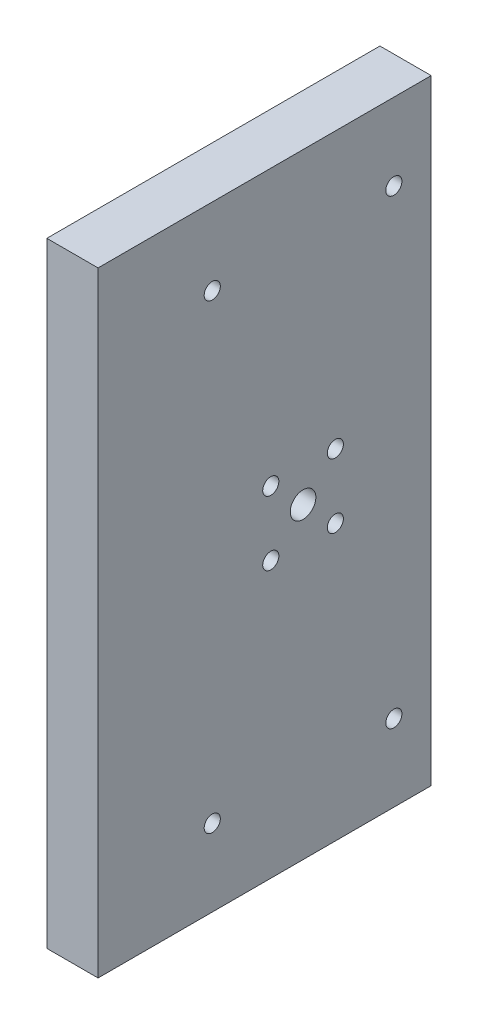
ISO-10303-21;
HEADER;
FILE_DESCRIPTION(('STEP AP214'),'2;1');
FILE_NAME('part.step','',(''),(''),'','','');
FILE_SCHEMA(('AUTOMOTIVE_DESIGN { 1 0 10303 214 1 1 1 1 }'));
ENDSEC;
DATA;
#1=APPLICATION_CONTEXT('core data for automotive mechanical design processes');
#2=APPLICATION_PROTOCOL_DEFINITION('international standard','automotive_design',2000,#1);
#3=PRODUCT_CONTEXT('',#1,'mechanical');
#4=PRODUCT('Part','Part','',(#3));
#5=PRODUCT_RELATED_PRODUCT_CATEGORY('part','',(#4));
#6=PRODUCT_DEFINITION_FORMATION('','',#4);
#7=PRODUCT_DEFINITION_CONTEXT('part definition',#1,'design');
#8=PRODUCT_DEFINITION('design','',#6,#7);
#9=PRODUCT_DEFINITION_SHAPE('','',#8);
#10=(LENGTH_UNIT() NAMED_UNIT(*) SI_UNIT(.MILLI.,.METRE.));
#11=(NAMED_UNIT(*) PLANE_ANGLE_UNIT() SI_UNIT($,.RADIAN.));
#12=(NAMED_UNIT(*) SI_UNIT($,.STERADIAN.) SOLID_ANGLE_UNIT());
#13=UNCERTAINTY_MEASURE_WITH_UNIT(LENGTH_MEASURE(1.E-05),#10,'distance_accuracy_value','');
#14=(GEOMETRIC_REPRESENTATION_CONTEXT(3) GLOBAL_UNCERTAINTY_ASSIGNED_CONTEXT((#13)) GLOBAL_UNIT_ASSIGNED_CONTEXT((#10,
#11,#12)) REPRESENTATION_CONTEXT('',''));
#15=CARTESIAN_POINT('',(0.,0.,0.));
#16=DIRECTION('',(0.,0.,1.));
#17=DIRECTION('',(1.,0.,0.));
#18=AXIS2_PLACEMENT_3D('',#15,#16,#17);
#19=CARTESIAN_POINT('',(12.7,76.2,-41.275));
#20=DIRECTION('',(0.,0.,1.));
#21=DIRECTION('',(0.,-1.,0.));
#22=AXIS2_PLACEMENT_3D('',#19,#20,#21);
#23=PLANE('',#22);
#24=DIRECTION('',(0.,1.,0.));
#25=VECTOR('',#24,1.);
#26=CARTESIAN_POINT('',(0.,76.2,-41.275));
#27=LINE('',#26,#25);
#28=CARTESIAN_POINT('',(0.,-76.2,-41.275));
#29=VERTEX_POINT('',#28);
#30=CARTESIAN_POINT('',(0.,76.2,-41.275));
#31=VERTEX_POINT('',#30);
#32=EDGE_CURVE('E102',#29,#31,#27,.T.);
#33=ORIENTED_EDGE('',*,*,#32,.T.);
#34=DIRECTION('',(-1.,0.,0.));
#35=VECTOR('',#34,1.);
#36=CARTESIAN_POINT('',(12.7,76.2,-41.275));
#37=LINE('',#36,#35);
#38=CARTESIAN_POINT('',(12.7,76.2,-41.275));
#39=VERTEX_POINT('',#38);
#40=EDGE_CURVE('E11',#39,#31,#37,.T.);
#41=ORIENTED_EDGE('',*,*,#40,.F.);
#42=DIRECTION('',(0.,1.,0.));
#43=VECTOR('',#42,1.);
#44=CARTESIAN_POINT('',(12.7,76.2,-41.275));
#45=LINE('',#44,#43);
#46=CARTESIAN_POINT('',(12.7,-76.2,-41.275));
#47=VERTEX_POINT('',#46);
#48=EDGE_CURVE('E89',#47,#39,#45,.T.);
#49=ORIENTED_EDGE('',*,*,#48,.F.);
#50=DIRECTION('',(-1.,0.,0.));
#51=VECTOR('',#50,1.);
#52=CARTESIAN_POINT('',(12.7,-76.2,-41.275));
#53=LINE('',#52,#51);
#54=EDGE_CURVE('E98',#47,#29,#53,.T.);
#55=ORIENTED_EDGE('',*,*,#54,.T.);
#56=EDGE_LOOP('',(#33,#41,#49,#55));
#57=FACE_BOUND('',#56,.T.);
#58=ADVANCED_FACE('F36',(#57),#23,.F.);
#59=CARTESIAN_POINT('',(12.7,76.2,41.275));
#60=DIRECTION('',(0.,-1.,0.));
#61=DIRECTION('',(0.,0.,-1.));
#62=AXIS2_PLACEMENT_3D('',#59,#60,#61);
#63=PLANE('',#62);
#64=DIRECTION('',(0.,0.,1.));
#65=VECTOR('',#64,1.);
#66=CARTESIAN_POINT('',(0.,76.2,41.275));
#67=LINE('',#66,#65);
#68=CARTESIAN_POINT('',(0.,76.2,41.275));
#69=VERTEX_POINT('',#68);
#70=EDGE_CURVE('E93',#31,#69,#67,.T.);
#71=ORIENTED_EDGE('',*,*,#70,.T.);
#72=DIRECTION('',(-1.,0.,0.));
#73=VECTOR('',#72,1.);
#74=CARTESIAN_POINT('',(12.7,76.2,41.275));
#75=LINE('',#74,#73);
#76=CARTESIAN_POINT('',(12.7,76.2,41.275));
#77=VERTEX_POINT('',#76);
#78=EDGE_CURVE('E45',#77,#69,#75,.T.);
#79=ORIENTED_EDGE('',*,*,#78,.F.);
#80=DIRECTION('',(0.,0.,1.));
#81=VECTOR('',#80,1.);
#82=CARTESIAN_POINT('',(12.7,76.2,41.275));
#83=LINE('',#82,#81);
#84=EDGE_CURVE('E84',#39,#77,#83,.T.);
#85=ORIENTED_EDGE('',*,*,#84,.F.);
#86=ORIENTED_EDGE('',*,*,#40,.T.);
#87=EDGE_LOOP('',(#71,#79,#85,#86));
#88=FACE_BOUND('',#87,.T.);
#89=ADVANCED_FACE('F92',(#88),#63,.F.);
#90=CARTESIAN_POINT('',(12.7,76.2,41.275));
#91=DIRECTION('',(0.,0.,-1.));
#92=DIRECTION('',(0.,1.,0.));
#93=AXIS2_PLACEMENT_3D('',#90,#91,#92);
#94=PLANE('',#93);
#95=DIRECTION('',(0.,-1.,0.));
#96=VECTOR('',#95,1.);
#97=CARTESIAN_POINT('',(0.,76.2,41.275));
#98=LINE('',#97,#96);
#99=CARTESIAN_POINT('',(0.,-76.2,41.275));
#100=VERTEX_POINT('',#99);
#101=EDGE_CURVE('E71',#69,#100,#98,.T.);
#102=ORIENTED_EDGE('',*,*,#101,.T.);
#103=DIRECTION('',(-1.,0.,0.));
#104=VECTOR('',#103,1.);
#105=CARTESIAN_POINT('',(12.7,-76.2,41.275));
#106=LINE('',#105,#104);
#107=CARTESIAN_POINT('',(12.7,-76.2,41.275));
#108=VERTEX_POINT('',#107);
#109=EDGE_CURVE('E94',#108,#100,#106,.T.);
#110=ORIENTED_EDGE('',*,*,#109,.F.);
#111=DIRECTION('',(0.,-1.,0.));
#112=VECTOR('',#111,1.);
#113=CARTESIAN_POINT('',(12.7,76.2,41.275));
#114=LINE('',#113,#112);
#115=EDGE_CURVE('E87',#77,#108,#114,.T.);
#116=ORIENTED_EDGE('',*,*,#115,.F.);
#117=ORIENTED_EDGE('',*,*,#78,.T.);
#118=EDGE_LOOP('',(#102,#110,#116,#117));
#119=FACE_BOUND('',#118,.T.);
#120=ADVANCED_FACE('F96',(#119),#94,.F.);
#121=CARTESIAN_POINT('',(12.7,-76.2,41.275));
#122=DIRECTION('',(0.,1.,0.));
#123=DIRECTION('',(0.,0.,1.));
#124=AXIS2_PLACEMENT_3D('',#121,#122,#123);
#125=PLANE('',#124);
#126=DIRECTION('',(0.,0.,-1.));
#127=VECTOR('',#126,1.);
#128=CARTESIAN_POINT('',(0.,-76.2,41.275));
#129=LINE('',#128,#127);
#130=EDGE_CURVE('E77',#100,#29,#129,.T.);
#131=ORIENTED_EDGE('',*,*,#130,.T.);
#132=ORIENTED_EDGE('',*,*,#54,.F.);
#133=DIRECTION('',(0.,0.,-1.));
#134=VECTOR('',#133,1.);
#135=CARTESIAN_POINT('',(12.7,-76.2,41.275));
#136=LINE('',#135,#134);
#137=EDGE_CURVE('E54',#108,#47,#136,.T.);
#138=ORIENTED_EDGE('',*,*,#137,.F.);
#139=ORIENTED_EDGE('',*,*,#109,.T.);
#140=EDGE_LOOP('',(#131,#132,#138,#139));
#141=FACE_BOUND('',#140,.T.);
#142=ADVANCED_FACE('F170',(#141),#125,.F.);
#143=CARTESIAN_POINT('',(12.7,0.,0.));
#144=DIRECTION('',(1.,0.,0.));
#145=DIRECTION('',(0.,0.,-1.));
#146=AXIS2_PLACEMENT_3D('',#143,#144,#145);
#147=PLANE('',#146);
#148=CARTESIAN_POINT('',(12.7,-7.99999999999999,-17.525));
#149=DIRECTION('',(1.,0.,0.));
#150=DIRECTION('',(0.,0.,-1.));
#151=AXIS2_PLACEMENT_3D('',#148,#149,#150);
#152=CIRCLE('',#151,2.);
#153=CARTESIAN_POINT('',(12.7,-7.99999999999999,-19.525));
#154=VERTEX_POINT('',#153);
#155=EDGE_CURVE('E122',#154,#154,#152,.T.);
#156=ORIENTED_EDGE('',*,*,#155,.F.);
#157=EDGE_LOOP('',(#156));
#158=FACE_BOUND('',#157,.T.);
#159=CARTESIAN_POINT('',(12.7,-7.99999999999999,-1.525));
#160=DIRECTION('',(1.,0.,0.));
#161=DIRECTION('',(0.,0.,-1.));
#162=AXIS2_PLACEMENT_3D('',#159,#160,#161);
#163=CIRCLE('',#162,2.);
#164=CARTESIAN_POINT('',(12.7,-7.99999999999999,-3.525));
#165=VERTEX_POINT('',#164);
#166=EDGE_CURVE('E126',#165,#165,#163,.T.);
#167=ORIENTED_EDGE('',*,*,#166,.F.);
#168=EDGE_LOOP('',(#167));
#169=FACE_BOUND('',#168,.T.);
#170=CARTESIAN_POINT('',(12.7,8.00000000000001,-1.525));
#171=DIRECTION('',(1.,0.,0.));
#172=DIRECTION('',(0.,0.,-1.));
#173=AXIS2_PLACEMENT_3D('',#170,#171,#172);
#174=CIRCLE('',#173,2.);
#175=CARTESIAN_POINT('',(12.7,8.00000000000001,-3.525));
#176=VERTEX_POINT('',#175);
#177=EDGE_CURVE('E131',#176,#176,#174,.T.);
#178=ORIENTED_EDGE('',*,*,#177,.F.);
#179=EDGE_LOOP('',(#178));
#180=FACE_BOUND('',#179,.T.);
#181=CARTESIAN_POINT('',(12.7,8.00000000000001,-17.525));
#182=DIRECTION('',(1.,0.,0.));
#183=DIRECTION('',(0.,0.,-1.));
#184=AXIS2_PLACEMENT_3D('',#181,#182,#183);
#185=CIRCLE('',#184,2.);
#186=CARTESIAN_POINT('',(12.7,8.00000000000001,-19.525));
#187=VERTEX_POINT('',#186);
#188=EDGE_CURVE('E142',#187,#187,#185,.T.);
#189=ORIENTED_EDGE('',*,*,#188,.F.);
#190=EDGE_LOOP('',(#189));
#191=FACE_BOUND('',#190,.T.);
#192=CARTESIAN_POINT('',(12.7,0.,-9.525));
#193=DIRECTION('',(1.,0.,0.));
#194=DIRECTION('',(0.,0.,-1.));
#195=AXIS2_PLACEMENT_3D('',#192,#193,#194);
#196=CIRCLE('',#195,3.175);
#197=CARTESIAN_POINT('',(12.7,0.,-12.7));
#198=VERTEX_POINT('',#197);
#199=EDGE_CURVE('E139',#198,#198,#196,.T.);
#200=ORIENTED_EDGE('',*,*,#199,.F.);
#201=EDGE_LOOP('',(#200));
#202=FACE_BOUND('',#201,.T.);
#203=CARTESIAN_POINT('',(12.7,57.15,-32.025000042));
#204=DIRECTION('',(1.,0.,0.));
#205=DIRECTION('',(0.,0.,-1.));
#206=AXIS2_PLACEMENT_3D('',#203,#204,#205);
#207=CIRCLE('',#206,2.);
#208=CARTESIAN_POINT('',(12.7,57.15,-34.025000042));
#209=VERTEX_POINT('',#208);
#210=EDGE_CURVE('E153',#209,#209,#207,.T.);
#211=ORIENTED_EDGE('',*,*,#210,.F.);
#212=EDGE_LOOP('',(#211));
#213=FACE_BOUND('',#212,.T.);
#214=CARTESIAN_POINT('',(12.7,-57.15,12.974999958));
#215=DIRECTION('',(1.,0.,0.));
#216=DIRECTION('',(0.,0.,-1.));
#217=AXIS2_PLACEMENT_3D('',#214,#215,#216);
#218=CIRCLE('',#217,2.);
#219=CARTESIAN_POINT('',(12.7,-57.15,10.974999958));
#220=VERTEX_POINT('',#219);
#221=EDGE_CURVE('E146',#220,#220,#218,.T.);
#222=ORIENTED_EDGE('',*,*,#221,.F.);
#223=EDGE_LOOP('',(#222));
#224=FACE_BOUND('',#223,.T.);
#225=CARTESIAN_POINT('',(12.7,-57.15,-32.025000042));
#226=DIRECTION('',(1.,0.,0.));
#227=DIRECTION('',(0.,0.,-1.));
#228=AXIS2_PLACEMENT_3D('',#225,#226,#227);
#229=CIRCLE('',#228,2.);
#230=CARTESIAN_POINT('',(12.7,-57.15,-34.025000042));
#231=VERTEX_POINT('',#230);
#232=EDGE_CURVE('E138',#231,#231,#229,.T.);
#233=ORIENTED_EDGE('',*,*,#232,.F.);
#234=EDGE_LOOP('',(#233));
#235=FACE_BOUND('',#234,.T.);
#236=CARTESIAN_POINT('',(12.7,57.15,12.974999958));
#237=DIRECTION('',(1.,0.,0.));
#238=DIRECTION('',(0.,0.,-1.));
#239=AXIS2_PLACEMENT_3D('',#236,#237,#238);
#240=CIRCLE('',#239,2.);
#241=CARTESIAN_POINT('',(12.7,57.15,10.974999958));
#242=VERTEX_POINT('',#241);
#243=EDGE_CURVE('E152',#242,#242,#240,.T.);
#244=ORIENTED_EDGE('',*,*,#243,.F.);
#245=EDGE_LOOP('',(#244));
#246=FACE_BOUND('',#245,.T.);
#247=ORIENTED_EDGE('',*,*,#48,.T.);
#248=ORIENTED_EDGE('',*,*,#84,.T.);
#249=ORIENTED_EDGE('',*,*,#115,.T.);
#250=ORIENTED_EDGE('',*,*,#137,.T.);
#251=EDGE_LOOP('',(#247,#248,#249,#250));
#252=FACE_BOUND('',#251,.T.);
#253=ADVANCED_FACE('F85',(#158,#169,#180,#191,#202,#213,#224,#235,#246,#252),#147,.T.);
#254=CARTESIAN_POINT('',(0.,0.,0.));
#255=DIRECTION('',(1.,0.,0.));
#256=DIRECTION('',(0.,0.,-1.));
#257=AXIS2_PLACEMENT_3D('',#254,#255,#256);
#258=PLANE('',#257);
#259=CARTESIAN_POINT('',(0.,-7.99999999999999,-17.525));
#260=DIRECTION('',(1.,0.,0.));
#261=DIRECTION('',(0.,0.,-1.));
#262=AXIS2_PLACEMENT_3D('',#259,#260,#261);
#263=CIRCLE('',#262,4.7625);
#264=CARTESIAN_POINT('',(0.,-7.99999999999999,-12.7625));
#265=VERTEX_POINT('',#264);
#266=EDGE_CURVE('E414',#265,#265,#263,.T.);
#267=ORIENTED_EDGE('',*,*,#266,.T.);
#268=EDGE_LOOP('',(#267));
#269=FACE_BOUND('',#268,.T.);
#270=CARTESIAN_POINT('',(0.,-7.99999999999999,-1.525));
#271=DIRECTION('',(1.,0.,0.));
#272=DIRECTION('',(0.,0.,-1.));
#273=AXIS2_PLACEMENT_3D('',#270,#271,#272);
#274=CIRCLE('',#273,4.7625);
#275=CARTESIAN_POINT('',(0.,-7.99999999999999,3.2375));
#276=VERTEX_POINT('',#275);
#277=EDGE_CURVE('E420',#276,#276,#274,.T.);
#278=ORIENTED_EDGE('',*,*,#277,.T.);
#279=EDGE_LOOP('',(#278));
#280=FACE_BOUND('',#279,.T.);
#281=CARTESIAN_POINT('',(0.,8.00000000000001,-1.525));
#282=DIRECTION('',(1.,0.,0.));
#283=DIRECTION('',(0.,0.,-1.));
#284=AXIS2_PLACEMENT_3D('',#281,#282,#283);
#285=CIRCLE('',#284,4.7625);
#286=CARTESIAN_POINT('',(0.,8.00000000000001,3.2375));
#287=VERTEX_POINT('',#286);
#288=EDGE_CURVE('E390',#287,#287,#285,.T.);
#289=ORIENTED_EDGE('',*,*,#288,.T.);
#290=EDGE_LOOP('',(#289));
#291=FACE_BOUND('',#290,.T.);
#292=CARTESIAN_POINT('',(0.,8.00000000000001,-17.525));
#293=DIRECTION('',(1.,0.,0.));
#294=DIRECTION('',(0.,0.,-1.));
#295=AXIS2_PLACEMENT_3D('',#292,#293,#294);
#296=CIRCLE('',#295,4.7625);
#297=CARTESIAN_POINT('',(0.,8.00000000000001,-12.7625));
#298=VERTEX_POINT('',#297);
#299=EDGE_CURVE('E384',#298,#298,#296,.T.);
#300=ORIENTED_EDGE('',*,*,#299,.T.);
#301=EDGE_LOOP('',(#300));
#302=FACE_BOUND('',#301,.T.);
#303=CARTESIAN_POINT('',(0.,0.,-9.525));
#304=DIRECTION('',(1.,0.,0.));
#305=DIRECTION('',(0.,0.,-1.));
#306=AXIS2_PLACEMENT_3D('',#303,#304,#305);
#307=CIRCLE('',#306,3.175);
#308=CARTESIAN_POINT('',(0.,0.,-12.7));
#309=VERTEX_POINT('',#308);
#310=EDGE_CURVE('E135',#309,#309,#307,.T.);
#311=ORIENTED_EDGE('',*,*,#310,.T.);
#312=EDGE_LOOP('',(#311));
#313=FACE_BOUND('',#312,.T.);
#314=CARTESIAN_POINT('',(0.,57.15,-32.025000042));
#315=DIRECTION('',(1.,0.,0.));
#316=DIRECTION('',(0.,0.,-1.));
#317=AXIS2_PLACEMENT_3D('',#314,#315,#316);
#318=CIRCLE('',#317,2.);
#319=CARTESIAN_POINT('',(0.,57.15,-34.025000042));
#320=VERTEX_POINT('',#319);
#321=EDGE_CURVE('E149',#320,#320,#318,.T.);
#322=ORIENTED_EDGE('',*,*,#321,.T.);
#323=EDGE_LOOP('',(#322));
#324=FACE_BOUND('',#323,.T.);
#325=CARTESIAN_POINT('',(0.,-57.15,12.974999958));
#326=DIRECTION('',(1.,0.,0.));
#327=DIRECTION('',(0.,0.,-1.));
#328=AXIS2_PLACEMENT_3D('',#325,#326,#327);
#329=CIRCLE('',#328,2.);
#330=CARTESIAN_POINT('',(0.,-57.15,10.974999958));
#331=VERTEX_POINT('',#330);
#332=EDGE_CURVE('E156',#331,#331,#329,.T.);
#333=ORIENTED_EDGE('',*,*,#332,.T.);
#334=EDGE_LOOP('',(#333));
#335=FACE_BOUND('',#334,.T.);
#336=CARTESIAN_POINT('',(0.,-57.15,-32.025000042));
#337=DIRECTION('',(1.,0.,0.));
#338=DIRECTION('',(0.,0.,-1.));
#339=AXIS2_PLACEMENT_3D('',#336,#337,#338);
#340=CIRCLE('',#339,2.);
#341=CARTESIAN_POINT('',(0.,-57.15,-34.025000042));
#342=VERTEX_POINT('',#341);
#343=EDGE_CURVE('E143',#342,#342,#340,.T.);
#344=ORIENTED_EDGE('',*,*,#343,.T.);
#345=EDGE_LOOP('',(#344));
#346=FACE_BOUND('',#345,.T.);
#347=CARTESIAN_POINT('',(0.,57.15,12.974999958));
#348=DIRECTION('',(1.,0.,0.));
#349=DIRECTION('',(0.,0.,-1.));
#350=AXIS2_PLACEMENT_3D('',#347,#348,#349);
#351=CIRCLE('',#350,2.);
#352=CARTESIAN_POINT('',(0.,57.15,10.974999958));
#353=VERTEX_POINT('',#352);
#354=EDGE_CURVE('E105',#353,#353,#351,.T.);
#355=ORIENTED_EDGE('',*,*,#354,.T.);
#356=EDGE_LOOP('',(#355));
#357=FACE_BOUND('',#356,.T.);
#358=ORIENTED_EDGE('',*,*,#32,.F.);
#359=ORIENTED_EDGE('',*,*,#130,.F.);
#360=ORIENTED_EDGE('',*,*,#101,.F.);
#361=ORIENTED_EDGE('',*,*,#70,.F.);
#362=EDGE_LOOP('',(#358,#359,#360,#361));
#363=FACE_BOUND('',#362,.T.);
#364=ADVANCED_FACE('F169',(#269,#280,#291,#302,#313,#324,#335,#346,#357,#363),#258,.F.);
#365=CARTESIAN_POINT('',(0.,57.15,12.974999958));
#366=DIRECTION('',(1.,0.,0.));
#367=DIRECTION('',(0.,0.,-1.));
#368=AXIS2_PLACEMENT_3D('',#365,#366,#367);
#369=CYLINDRICAL_SURFACE('',#368,2.);
#370=ORIENTED_EDGE('',*,*,#354,.F.);
#371=EDGE_LOOP('',(#370));
#372=FACE_BOUND('',#371,.T.);
#373=ORIENTED_EDGE('',*,*,#243,.T.);
#374=EDGE_LOOP('',(#373));
#375=FACE_BOUND('',#374,.T.);
#376=ADVANCED_FACE('F166',(#372,#375),#369,.F.);
#377=CARTESIAN_POINT('',(0.,-57.15,-32.025000042));
#378=DIRECTION('',(1.,0.,0.));
#379=DIRECTION('',(0.,0.,-1.));
#380=AXIS2_PLACEMENT_3D('',#377,#378,#379);
#381=CYLINDRICAL_SURFACE('',#380,2.);
#382=ORIENTED_EDGE('',*,*,#343,.F.);
#383=EDGE_LOOP('',(#382));
#384=FACE_BOUND('',#383,.T.);
#385=ORIENTED_EDGE('',*,*,#232,.T.);
#386=EDGE_LOOP('',(#385));
#387=FACE_BOUND('',#386,.T.);
#388=ADVANCED_FACE('F209',(#384,#387),#381,.F.);
#389=CARTESIAN_POINT('',(0.,-57.15,12.974999958));
#390=DIRECTION('',(1.,0.,0.));
#391=DIRECTION('',(0.,0.,-1.));
#392=AXIS2_PLACEMENT_3D('',#389,#390,#391);
#393=CYLINDRICAL_SURFACE('',#392,2.);
#394=ORIENTED_EDGE('',*,*,#332,.F.);
#395=EDGE_LOOP('',(#394));
#396=FACE_BOUND('',#395,.T.);
#397=ORIENTED_EDGE('',*,*,#221,.T.);
#398=EDGE_LOOP('',(#397));
#399=FACE_BOUND('',#398,.T.);
#400=ADVANCED_FACE('F219',(#396,#399),#393,.F.);
#401=CARTESIAN_POINT('',(0.,57.15,-32.025000042));
#402=DIRECTION('',(1.,0.,0.));
#403=DIRECTION('',(0.,0.,-1.));
#404=AXIS2_PLACEMENT_3D('',#401,#402,#403);
#405=CYLINDRICAL_SURFACE('',#404,2.);
#406=ORIENTED_EDGE('',*,*,#321,.F.);
#407=EDGE_LOOP('',(#406));
#408=FACE_BOUND('',#407,.T.);
#409=ORIENTED_EDGE('',*,*,#210,.T.);
#410=EDGE_LOOP('',(#409));
#411=FACE_BOUND('',#410,.T.);
#412=ADVANCED_FACE('F229',(#408,#411),#405,.F.);
#413=CARTESIAN_POINT('',(0.,0.,-9.525));
#414=DIRECTION('',(1.,0.,0.));
#415=DIRECTION('',(0.,0.,-1.));
#416=AXIS2_PLACEMENT_3D('',#413,#414,#415);
#417=CYLINDRICAL_SURFACE('',#416,3.175);
#418=ORIENTED_EDGE('',*,*,#310,.F.);
#419=EDGE_LOOP('',(#418));
#420=FACE_BOUND('',#419,.T.);
#421=ORIENTED_EDGE('',*,*,#199,.T.);
#422=EDGE_LOOP('',(#421));
#423=FACE_BOUND('',#422,.T.);
#424=ADVANCED_FACE('F238',(#420,#423),#417,.F.);
#425=CARTESIAN_POINT('',(0.,8.00000000000001,-17.525));
#426=DIRECTION('',(1.,0.,0.));
#427=DIRECTION('',(0.,0.,-1.));
#428=AXIS2_PLACEMENT_3D('',#425,#426,#427);
#429=CYLINDRICAL_SURFACE('',#428,2.);
#430=CARTESIAN_POINT('',(4.7625,8.00000000000001,-17.525));
#431=DIRECTION('',(1.,0.,0.));
#432=DIRECTION('',(0.,0.,-1.));
#433=AXIS2_PLACEMENT_3D('',#430,#431,#432);
#434=CIRCLE('',#433,2.);
#435=CARTESIAN_POINT('',(4.7625,8.00000000000001,-19.525));
#436=VERTEX_POINT('',#435);
#437=EDGE_CURVE('E39',#436,#436,#434,.F.);
#438=ORIENTED_EDGE('',*,*,#437,.T.);
#439=EDGE_LOOP('',(#438));
#440=FACE_BOUND('',#439,.T.);
#441=ORIENTED_EDGE('',*,*,#188,.T.);
#442=EDGE_LOOP('',(#441));
#443=FACE_BOUND('',#442,.T.);
#444=ADVANCED_FACE('F252',(#440,#443),#429,.F.);
#445=CARTESIAN_POINT('',(0.,8.00000000000001,-1.525));
#446=DIRECTION('',(1.,0.,0.));
#447=DIRECTION('',(0.,0.,-1.));
#448=AXIS2_PLACEMENT_3D('',#445,#446,#447);
#449=CYLINDRICAL_SURFACE('',#448,2.);
#450=CARTESIAN_POINT('',(4.7625,8.00000000000001,-1.525));
#451=DIRECTION('',(1.,0.,0.));
#452=DIRECTION('',(0.,0.,-1.));
#453=AXIS2_PLACEMENT_3D('',#450,#451,#452);
#454=CIRCLE('',#453,2.);
#455=CARTESIAN_POINT('',(4.7625,8.00000000000001,-3.525));
#456=VERTEX_POINT('',#455);
#457=EDGE_CURVE('E117',#456,#456,#454,.F.);
#458=ORIENTED_EDGE('',*,*,#457,.T.);
#459=EDGE_LOOP('',(#458));
#460=FACE_BOUND('',#459,.T.);
#461=ORIENTED_EDGE('',*,*,#177,.T.);
#462=EDGE_LOOP('',(#461));
#463=FACE_BOUND('',#462,.T.);
#464=ADVANCED_FACE('F267',(#460,#463),#449,.F.);
#465=CARTESIAN_POINT('',(0.,-7.99999999999999,-1.525));
#466=DIRECTION('',(1.,0.,0.));
#467=DIRECTION('',(0.,0.,-1.));
#468=AXIS2_PLACEMENT_3D('',#465,#466,#467);
#469=CYLINDRICAL_SURFACE('',#468,2.);
#470=CARTESIAN_POINT('',(4.7625,-7.99999999999999,-1.525));
#471=DIRECTION('',(1.,0.,0.));
#472=DIRECTION('',(0.,0.,-1.));
#473=AXIS2_PLACEMENT_3D('',#470,#471,#472);
#474=CIRCLE('',#473,2.);
#475=CARTESIAN_POINT('',(4.7625,-7.99999999999999,-3.525));
#476=VERTEX_POINT('',#475);
#477=EDGE_CURVE('E114',#476,#476,#474,.F.);
#478=ORIENTED_EDGE('',*,*,#477,.T.);
#479=EDGE_LOOP('',(#478));
#480=FACE_BOUND('',#479,.T.);
#481=ORIENTED_EDGE('',*,*,#166,.T.);
#482=EDGE_LOOP('',(#481));
#483=FACE_BOUND('',#482,.T.);
#484=ADVANCED_FACE('F276',(#480,#483),#469,.F.);
#485=CARTESIAN_POINT('',(0.,-7.99999999999999,-17.525));
#486=DIRECTION('',(1.,0.,0.));
#487=DIRECTION('',(0.,0.,-1.));
#488=AXIS2_PLACEMENT_3D('',#485,#486,#487);
#489=CYLINDRICAL_SURFACE('',#488,2.);
#490=CARTESIAN_POINT('',(4.7625,-7.99999999999999,-17.525));
#491=DIRECTION('',(1.,0.,0.));
#492=DIRECTION('',(0.,0.,-1.));
#493=AXIS2_PLACEMENT_3D('',#490,#491,#492);
#494=CIRCLE('',#493,2.);
#495=CARTESIAN_POINT('',(4.7625,-7.99999999999999,-19.525));
#496=VERTEX_POINT('',#495);
#497=EDGE_CURVE('E111',#496,#496,#494,.F.);
#498=ORIENTED_EDGE('',*,*,#497,.T.);
#499=EDGE_LOOP('',(#498));
#500=FACE_BOUND('',#499,.T.);
#501=ORIENTED_EDGE('',*,*,#155,.T.);
#502=EDGE_LOOP('',(#501));
#503=FACE_BOUND('',#502,.T.);
#504=ADVANCED_FACE('F285',(#500,#503),#489,.F.);
#505=CARTESIAN_POINT('',(4.7625,-7.99999999999999,-17.525));
#506=DIRECTION('',(1.,0.,0.));
#507=DIRECTION('',(0.,0.,-1.));
#508=AXIS2_PLACEMENT_3D('',#505,#506,#507);
#509=PLANE('',#508);
#510=CARTESIAN_POINT('',(4.7625,-7.99999999999999,-17.525));
#511=DIRECTION('',(1.,0.,0.));
#512=DIRECTION('',(0.,0.,-1.));
#513=AXIS2_PLACEMENT_3D('',#510,#511,#512);
#514=CIRCLE('',#513,4.7625);
#515=CARTESIAN_POINT('',(4.7625,-7.99999999999999,-12.7625));
#516=VERTEX_POINT('',#515);
#517=EDGE_CURVE('E417',#516,#516,#514,.T.);
#518=ORIENTED_EDGE('',*,*,#517,.F.);
#519=EDGE_LOOP('',(#518));
#520=FACE_BOUND('',#519,.T.);
#521=ORIENTED_EDGE('',*,*,#497,.F.);
#522=EDGE_LOOP('',(#521));
#523=FACE_BOUND('',#522,.T.);
#524=ADVANCED_FACE('F295',(#520,#523),#509,.F.);
#525=CARTESIAN_POINT('',(4.7625,-7.99999999999999,-17.525));
#526=DIRECTION('',(-1.,0.,0.));
#527=DIRECTION('',(0.,0.,1.));
#528=AXIS2_PLACEMENT_3D('',#525,#526,#527);
#529=CYLINDRICAL_SURFACE('',#528,4.7625);
#530=CARTESIAN_POINT('',(4.7625,-7.99999999999999,-12.7625));
#531=CARTESIAN_POINT('',(4.712890625,-7.99999999999999,-12.7625));
#532=CARTESIAN_POINT('',(4.66328125,-7.99999999999999,-12.7625));
#533=CARTESIAN_POINT('',(4.5640625,-7.99999999999999,-12.7625));
#534=CARTESIAN_POINT('',(4.514453125,-7.99999999999999,-12.7625));
#535=CARTESIAN_POINT('',(4.415234375,-7.99999999999999,-12.7625));
#536=CARTESIAN_POINT('',(4.365625,-7.99999999999999,-12.7625));
#537=CARTESIAN_POINT('',(4.26640625,-7.99999999999999,-12.7625));
#538=CARTESIAN_POINT('',(4.216796875,-7.99999999999999,-12.7625));
#539=CARTESIAN_POINT('',(4.117578125,-7.99999999999999,-12.7625));
#540=CARTESIAN_POINT('',(4.06796875,-7.99999999999999,-12.7625));
#541=CARTESIAN_POINT('',(3.96875,-7.99999999999999,-12.7625));
#542=CARTESIAN_POINT('',(3.919140625,-7.99999999999999,-12.7625));
#543=CARTESIAN_POINT('',(3.819921875,-7.99999999999999,-12.7625));
#544=CARTESIAN_POINT('',(3.7703125,-7.99999999999999,-12.7625));
#545=CARTESIAN_POINT('',(3.67109375,-7.99999999999999,-12.7625));
#546=CARTESIAN_POINT('',(3.621484375,-7.99999999999999,-12.7625));
#547=CARTESIAN_POINT('',(3.522265625,-7.99999999999999,-12.7625));
#548=CARTESIAN_POINT('',(3.47265625,-7.99999999999999,-12.7625));
#549=CARTESIAN_POINT('',(3.3734375,-7.99999999999999,-12.7625));
#550=CARTESIAN_POINT('',(3.323828125,-7.99999999999999,-12.7625));
#551=CARTESIAN_POINT('',(3.224609375,-7.99999999999999,-12.7625));
#552=CARTESIAN_POINT('',(3.175,-7.99999999999999,-12.7625));
#553=CARTESIAN_POINT('',(3.07578125,-7.99999999999999,-12.7625));
#554=CARTESIAN_POINT('',(3.026171875,-7.99999999999999,-12.7625));
#555=CARTESIAN_POINT('',(2.926953125,-7.99999999999999,-12.7625));
#556=CARTESIAN_POINT('',(2.87734375,-7.99999999999999,-12.7625));
#557=CARTESIAN_POINT('',(2.778125,-7.99999999999999,-12.7625));
#558=CARTESIAN_POINT('',(2.728515625,-7.99999999999999,-12.7625));
#559=CARTESIAN_POINT('',(2.629296875,-7.99999999999999,-12.7625));
#560=CARTESIAN_POINT('',(2.5796875,-7.99999999999999,-12.7625));
#561=CARTESIAN_POINT('',(2.48046875,-7.99999999999999,-12.7625));
#562=CARTESIAN_POINT('',(2.430859375,-7.99999999999999,-12.7625));
#563=CARTESIAN_POINT('',(2.331640625,-7.99999999999999,-12.7625));
#564=CARTESIAN_POINT('',(2.28203125,-7.99999999999999,-12.7625));
#565=CARTESIAN_POINT('',(2.1828125,-7.99999999999999,-12.7625));
#566=CARTESIAN_POINT('',(2.133203125,-7.99999999999999,-12.7625));
#567=CARTESIAN_POINT('',(2.033984375,-7.99999999999999,-12.7625));
#568=CARTESIAN_POINT('',(1.984375,-7.99999999999999,-12.7625));
#569=CARTESIAN_POINT('',(1.88515625,-7.99999999999999,-12.7625));
#570=CARTESIAN_POINT('',(1.835546875,-7.99999999999999,-12.7625));
#571=CARTESIAN_POINT('',(1.736328125,-7.99999999999999,-12.7625));
#572=CARTESIAN_POINT('',(1.68671875,-7.99999999999999,-12.7625));
#573=CARTESIAN_POINT('',(1.5875,-7.99999999999999,-12.7625));
#574=CARTESIAN_POINT('',(1.537890625,-7.99999999999999,-12.7625));
#575=CARTESIAN_POINT('',(1.438671875,-7.99999999999999,-12.7625));
#576=CARTESIAN_POINT('',(1.3890625,-7.99999999999999,-12.7625));
#577=CARTESIAN_POINT('',(1.28984375,-7.99999999999999,-12.7625));
#578=CARTESIAN_POINT('',(1.240234375,-7.99999999999999,-12.7625));
#579=CARTESIAN_POINT('',(1.141015625,-7.99999999999999,-12.7625));
#580=CARTESIAN_POINT('',(1.09140625,-7.99999999999999,-12.7625));
#581=CARTESIAN_POINT('',(0.992187499999999,-7.99999999999999,-12.7625));
#582=CARTESIAN_POINT('',(0.942578124999999,-7.99999999999999,-12.7625));
#583=CARTESIAN_POINT('',(0.843359375,-7.99999999999999,-12.7625));
#584=CARTESIAN_POINT('',(0.79375,-7.99999999999999,-12.7625));
#585=CARTESIAN_POINT('',(0.69453125,-7.99999999999999,-12.7625));
#586=CARTESIAN_POINT('',(0.644921875,-7.99999999999999,-12.7625));
#587=CARTESIAN_POINT('',(0.545703125,-7.99999999999999,-12.7625));
#588=CARTESIAN_POINT('',(0.49609375,-7.99999999999999,-12.7625));
#589=CARTESIAN_POINT('',(0.396875,-7.99999999999999,-12.7625));
#590=CARTESIAN_POINT('',(0.347265625,-7.99999999999999,-12.7625));
#591=CARTESIAN_POINT('',(0.248046875,-7.99999999999999,-12.7625));
#592=CARTESIAN_POINT('',(0.1984375,-7.99999999999999,-12.7625));
#593=CARTESIAN_POINT('',(0.09921875,-7.99999999999999,-12.7625));
#594=CARTESIAN_POINT('',(0.049609375,-7.99999999999999,-12.7625));
#595=CARTESIAN_POINT('',(0.,-7.99999999999999,-12.7625));
#596=B_SPLINE_CURVE_WITH_KNOTS('',3,(#530,#531,#532,#533,#534,#535,#536,#537,#538,#539,#540,
#541,#542,#543,#544,#545,#546,#547,#548,#549,#550,#551,#552,#553,#554,#555,#556,#557,#558,#559,
#560,#561,#562,#563,#564,#565,#566,#567,#568,#569,#570,#571,#572,#573,#574,#575,#576,#577,#578,
#579,#580,#581,#582,#583,#584,#585,#586,#587,#588,#589,#590,#591,#592,#593,#594,#595),
.UNSPECIFIED.,.F.,.F.,(4,2,2,2,2,2,2,2,2,2,2,2,2,2,2,2,2,2,2,2,2,2,2,2,2,2,2,2,2,2,2,2,4),(0.,
0.148828125,0.29765625,0.446484375,0.5953125,0.744140625,0.892968750000001,1.041796875,1.190625,
1.339453125,1.48828125,1.637109375,1.7859375,1.934765625,2.08359375,2.232421875,2.38125,
2.530078125,2.67890625,2.827734375,2.9765625,3.125390625,3.27421875,3.423046875,3.571875,
3.720703125,3.86953125,4.018359375,4.1671875,4.316015625,4.46484375,4.613671875,4.7625),.UNSPECIFIED.);
#597=EDGE_CURVE('BSEAM305',#516,#265,#596,.T.);
#598=ORIENTED_EDGE('',*,*,#517,.T.);
#599=ORIENTED_EDGE('',*,*,#266,.F.);
#600=ORIENTED_EDGE('',*,*,#597,.T.);
#601=ORIENTED_EDGE('',*,*,#597,.F.);
#602=EDGE_LOOP('',(#598,#600,#599,#601));
#603=FACE_BOUND('',#602,.T.);
#604=ADVANCED_FACE('F305',(#603),#529,.F.);
#605=CARTESIAN_POINT('',(4.7625,-7.99999999999999,-1.525));
#606=DIRECTION('',(1.,0.,0.));
#607=DIRECTION('',(0.,0.,-1.));
#608=AXIS2_PLACEMENT_3D('',#605,#606,#607);
#609=PLANE('',#608);
#610=CARTESIAN_POINT('',(4.7625,-7.99999999999999,-1.525));
#611=DIRECTION('',(1.,0.,0.));
#612=DIRECTION('',(0.,0.,-1.));
#613=AXIS2_PLACEMENT_3D('',#610,#611,#612);
#614=CIRCLE('',#613,4.7625);
#615=CARTESIAN_POINT('',(4.7625,-7.99999999999999,3.2375));
#616=VERTEX_POINT('',#615);
#617=EDGE_CURVE('E423',#616,#616,#614,.T.);
#618=ORIENTED_EDGE('',*,*,#617,.F.);
#619=EDGE_LOOP('',(#618));
#620=FACE_BOUND('',#619,.T.);
#621=ORIENTED_EDGE('',*,*,#477,.F.);
#622=EDGE_LOOP('',(#621));
#623=FACE_BOUND('',#622,.T.);
#624=ADVANCED_FACE('F315',(#620,#623),#609,.F.);
#625=CARTESIAN_POINT('',(4.7625,-7.99999999999999,-1.525));
#626=DIRECTION('',(-1.,0.,0.));
#627=DIRECTION('',(0.,0.,1.));
#628=AXIS2_PLACEMENT_3D('',#625,#626,#627);
#629=CYLINDRICAL_SURFACE('',#628,4.7625);
#630=CARTESIAN_POINT('',(4.7625,-7.99999999999999,3.2375));
#631=CARTESIAN_POINT('',(4.712890625,-7.99999999999999,3.2375));
#632=CARTESIAN_POINT('',(4.66328125,-7.99999999999999,3.2375));
#633=CARTESIAN_POINT('',(4.5640625,-7.99999999999999,3.2375));
#634=CARTESIAN_POINT('',(4.514453125,-7.99999999999999,3.2375));
#635=CARTESIAN_POINT('',(4.415234375,-7.99999999999999,3.2375));
#636=CARTESIAN_POINT('',(4.365625,-7.99999999999999,3.2375));
#637=CARTESIAN_POINT('',(4.26640625,-7.99999999999999,3.2375));
#638=CARTESIAN_POINT('',(4.216796875,-7.99999999999999,3.2375));
#639=CARTESIAN_POINT('',(4.117578125,-7.99999999999999,3.2375));
#640=CARTESIAN_POINT('',(4.06796875,-7.99999999999999,3.2375));
#641=CARTESIAN_POINT('',(3.96875,-7.99999999999999,3.2375));
#642=CARTESIAN_POINT('',(3.919140625,-7.99999999999999,3.2375));
#643=CARTESIAN_POINT('',(3.819921875,-7.99999999999999,3.2375));
#644=CARTESIAN_POINT('',(3.7703125,-7.99999999999999,3.2375));
#645=CARTESIAN_POINT('',(3.67109375,-7.99999999999999,3.2375));
#646=CARTESIAN_POINT('',(3.621484375,-7.99999999999999,3.2375));
#647=CARTESIAN_POINT('',(3.522265625,-7.99999999999999,3.2375));
#648=CARTESIAN_POINT('',(3.47265625,-7.99999999999999,3.2375));
#649=CARTESIAN_POINT('',(3.3734375,-7.99999999999999,3.2375));
#650=CARTESIAN_POINT('',(3.323828125,-7.99999999999999,3.2375));
#651=CARTESIAN_POINT('',(3.224609375,-7.99999999999999,3.2375));
#652=CARTESIAN_POINT('',(3.175,-7.99999999999999,3.2375));
#653=CARTESIAN_POINT('',(3.07578125,-7.99999999999999,3.2375));
#654=CARTESIAN_POINT('',(3.026171875,-7.99999999999999,3.2375));
#655=CARTESIAN_POINT('',(2.926953125,-7.99999999999999,3.2375));
#656=CARTESIAN_POINT('',(2.87734375,-7.99999999999999,3.2375));
#657=CARTESIAN_POINT('',(2.778125,-7.99999999999999,3.2375));
#658=CARTESIAN_POINT('',(2.728515625,-7.99999999999999,3.2375));
#659=CARTESIAN_POINT('',(2.629296875,-7.99999999999999,3.2375));
#660=CARTESIAN_POINT('',(2.5796875,-7.99999999999999,3.2375));
#661=CARTESIAN_POINT('',(2.48046875,-7.99999999999999,3.2375));
#662=CARTESIAN_POINT('',(2.430859375,-7.99999999999999,3.2375));
#663=CARTESIAN_POINT('',(2.331640625,-7.99999999999999,3.2375));
#664=CARTESIAN_POINT('',(2.28203125,-7.99999999999999,3.2375));
#665=CARTESIAN_POINT('',(2.1828125,-7.99999999999999,3.2375));
#666=CARTESIAN_POINT('',(2.133203125,-7.99999999999999,3.2375));
#667=CARTESIAN_POINT('',(2.033984375,-7.99999999999999,3.2375));
#668=CARTESIAN_POINT('',(1.984375,-7.99999999999999,3.2375));
#669=CARTESIAN_POINT('',(1.88515625,-7.99999999999999,3.2375));
#670=CARTESIAN_POINT('',(1.835546875,-7.99999999999999,3.2375));
#671=CARTESIAN_POINT('',(1.736328125,-7.99999999999999,3.2375));
#672=CARTESIAN_POINT('',(1.68671875,-7.99999999999999,3.2375));
#673=CARTESIAN_POINT('',(1.5875,-7.99999999999999,3.2375));
#674=CARTESIAN_POINT('',(1.537890625,-7.99999999999999,3.2375));
#675=CARTESIAN_POINT('',(1.438671875,-7.99999999999999,3.2375));
#676=CARTESIAN_POINT('',(1.3890625,-7.99999999999999,3.2375));
#677=CARTESIAN_POINT('',(1.28984375,-7.99999999999999,3.2375));
#678=CARTESIAN_POINT('',(1.240234375,-7.99999999999999,3.2375));
#679=CARTESIAN_POINT('',(1.141015625,-7.99999999999999,3.2375));
#680=CARTESIAN_POINT('',(1.09140625,-7.99999999999999,3.2375));
#681=CARTESIAN_POINT('',(0.992187499999999,-7.99999999999999,3.2375));
#682=CARTESIAN_POINT('',(0.942578124999999,-7.99999999999999,3.2375));
#683=CARTESIAN_POINT('',(0.843359375,-7.99999999999999,3.2375));
#684=CARTESIAN_POINT('',(0.79375,-7.99999999999999,3.2375));
#685=CARTESIAN_POINT('',(0.69453125,-7.99999999999999,3.2375));
#686=CARTESIAN_POINT('',(0.644921875,-7.99999999999999,3.2375));
#687=CARTESIAN_POINT('',(0.545703125,-7.99999999999999,3.2375));
#688=CARTESIAN_POINT('',(0.49609375,-7.99999999999999,3.2375));
#689=CARTESIAN_POINT('',(0.396875,-7.99999999999999,3.2375));
#690=CARTESIAN_POINT('',(0.347265625,-7.99999999999999,3.2375));
#691=CARTESIAN_POINT('',(0.248046875,-7.99999999999999,3.2375));
#692=CARTESIAN_POINT('',(0.1984375,-7.99999999999999,3.2375));
#693=CARTESIAN_POINT('',(0.09921875,-7.99999999999999,3.2375));
#694=CARTESIAN_POINT('',(0.049609375,-7.99999999999999,3.2375));
#695=CARTESIAN_POINT('',(0.,-7.99999999999999,3.2375));
#696=B_SPLINE_CURVE_WITH_KNOTS('',3,(#630,#631,#632,#633,#634,#635,#636,#637,#638,#639,#640,
#641,#642,#643,#644,#645,#646,#647,#648,#649,#650,#651,#652,#653,#654,#655,#656,#657,#658,#659,
#660,#661,#662,#663,#664,#665,#666,#667,#668,#669,#670,#671,#672,#673,#674,#675,#676,#677,#678,
#679,#680,#681,#682,#683,#684,#685,#686,#687,#688,#689,#690,#691,#692,#693,#694,#695),
.UNSPECIFIED.,.F.,.F.,(4,2,2,2,2,2,2,2,2,2,2,2,2,2,2,2,2,2,2,2,2,2,2,2,2,2,2,2,2,2,2,2,4),(0.,
0.148828125,0.29765625,0.446484375,0.5953125,0.744140625,0.892968750000001,1.041796875,1.190625,
1.339453125,1.48828125,1.637109375,1.7859375,1.934765625,2.08359375,2.232421875,2.38125,
2.530078125,2.67890625,2.827734375,2.9765625,3.125390625,3.27421875,3.423046875,3.571875,
3.720703125,3.86953125,4.018359375,4.1671875,4.316015625,4.46484375,4.613671875,4.7625),.UNSPECIFIED.);
#697=EDGE_CURVE('BSEAM325',#616,#276,#696,.T.);
#698=ORIENTED_EDGE('',*,*,#617,.T.);
#699=ORIENTED_EDGE('',*,*,#277,.F.);
#700=ORIENTED_EDGE('',*,*,#697,.T.);
#701=ORIENTED_EDGE('',*,*,#697,.F.);
#702=EDGE_LOOP('',(#698,#700,#699,#701));
#703=FACE_BOUND('',#702,.T.);
#704=ADVANCED_FACE('F325',(#703),#629,.F.);
#705=CARTESIAN_POINT('',(4.7625,8.00000000000001,-1.525));
#706=DIRECTION('',(1.,0.,0.));
#707=DIRECTION('',(0.,0.,-1.));
#708=AXIS2_PLACEMENT_3D('',#705,#706,#707);
#709=PLANE('',#708);
#710=CARTESIAN_POINT('',(4.7625,8.00000000000001,-1.525));
#711=DIRECTION('',(1.,0.,0.));
#712=DIRECTION('',(0.,0.,-1.));
#713=AXIS2_PLACEMENT_3D('',#710,#711,#712);
#714=CIRCLE('',#713,4.7625);
#715=CARTESIAN_POINT('',(4.7625,8.00000000000001,3.2375));
#716=VERTEX_POINT('',#715);
#717=EDGE_CURVE('E386',#716,#716,#714,.T.);
#718=ORIENTED_EDGE('',*,*,#717,.F.);
#719=EDGE_LOOP('',(#718));
#720=FACE_BOUND('',#719,.T.);
#721=ORIENTED_EDGE('',*,*,#457,.F.);
#722=EDGE_LOOP('',(#721));
#723=FACE_BOUND('',#722,.T.);
#724=ADVANCED_FACE('F335',(#720,#723),#709,.F.);
#725=CARTESIAN_POINT('',(4.7625,8.00000000000001,-1.525));
#726=DIRECTION('',(-1.,0.,0.));
#727=DIRECTION('',(0.,0.,1.));
#728=AXIS2_PLACEMENT_3D('',#725,#726,#727);
#729=CYLINDRICAL_SURFACE('',#728,4.7625);
#730=CARTESIAN_POINT('',(4.7625,8.00000000000001,3.2375));
#731=CARTESIAN_POINT('',(4.712890625,8.00000000000001,3.2375));
#732=CARTESIAN_POINT('',(4.66328125,8.00000000000001,3.2375));
#733=CARTESIAN_POINT('',(4.5640625,8.00000000000001,3.2375));
#734=CARTESIAN_POINT('',(4.514453125,8.00000000000001,3.2375));
#735=CARTESIAN_POINT('',(4.415234375,8.00000000000001,3.2375));
#736=CARTESIAN_POINT('',(4.365625,8.00000000000001,3.2375));
#737=CARTESIAN_POINT('',(4.26640625,8.00000000000001,3.2375));
#738=CARTESIAN_POINT('',(4.216796875,8.00000000000001,3.2375));
#739=CARTESIAN_POINT('',(4.117578125,8.00000000000001,3.2375));
#740=CARTESIAN_POINT('',(4.06796875,8.00000000000001,3.2375));
#741=CARTESIAN_POINT('',(3.96875,8.00000000000001,3.2375));
#742=CARTESIAN_POINT('',(3.919140625,8.00000000000001,3.2375));
#743=CARTESIAN_POINT('',(3.819921875,8.00000000000001,3.2375));
#744=CARTESIAN_POINT('',(3.7703125,8.00000000000001,3.2375));
#745=CARTESIAN_POINT('',(3.67109375,8.00000000000001,3.2375));
#746=CARTESIAN_POINT('',(3.621484375,8.00000000000001,3.2375));
#747=CARTESIAN_POINT('',(3.522265625,8.00000000000001,3.2375));
#748=CARTESIAN_POINT('',(3.47265625,8.00000000000001,3.2375));
#749=CARTESIAN_POINT('',(3.3734375,8.00000000000001,3.2375));
#750=CARTESIAN_POINT('',(3.323828125,8.00000000000001,3.2375));
#751=CARTESIAN_POINT('',(3.224609375,8.00000000000001,3.2375));
#752=CARTESIAN_POINT('',(3.175,8.00000000000001,3.2375));
#753=CARTESIAN_POINT('',(3.07578125,8.00000000000001,3.2375));
#754=CARTESIAN_POINT('',(3.026171875,8.00000000000001,3.2375));
#755=CARTESIAN_POINT('',(2.926953125,8.00000000000001,3.2375));
#756=CARTESIAN_POINT('',(2.87734375,8.00000000000001,3.2375));
#757=CARTESIAN_POINT('',(2.778125,8.00000000000001,3.2375));
#758=CARTESIAN_POINT('',(2.728515625,8.00000000000001,3.2375));
#759=CARTESIAN_POINT('',(2.629296875,8.00000000000001,3.2375));
#760=CARTESIAN_POINT('',(2.5796875,8.00000000000001,3.2375));
#761=CARTESIAN_POINT('',(2.48046875,8.00000000000001,3.2375));
#762=CARTESIAN_POINT('',(2.430859375,8.00000000000001,3.2375));
#763=CARTESIAN_POINT('',(2.331640625,8.00000000000001,3.2375));
#764=CARTESIAN_POINT('',(2.28203125,8.00000000000001,3.2375));
#765=CARTESIAN_POINT('',(2.1828125,8.00000000000001,3.2375));
#766=CARTESIAN_POINT('',(2.133203125,8.00000000000001,3.2375));
#767=CARTESIAN_POINT('',(2.033984375,8.00000000000001,3.2375));
#768=CARTESIAN_POINT('',(1.984375,8.00000000000001,3.2375));
#769=CARTESIAN_POINT('',(1.88515625,8.00000000000001,3.2375));
#770=CARTESIAN_POINT('',(1.835546875,8.00000000000001,3.2375));
#771=CARTESIAN_POINT('',(1.736328125,8.00000000000001,3.2375));
#772=CARTESIAN_POINT('',(1.68671875,8.00000000000001,3.2375));
#773=CARTESIAN_POINT('',(1.5875,8.00000000000001,3.2375));
#774=CARTESIAN_POINT('',(1.537890625,8.00000000000001,3.2375));
#775=CARTESIAN_POINT('',(1.438671875,8.00000000000001,3.2375));
#776=CARTESIAN_POINT('',(1.3890625,8.00000000000001,3.2375));
#777=CARTESIAN_POINT('',(1.28984375,8.00000000000001,3.2375));
#778=CARTESIAN_POINT('',(1.240234375,8.00000000000001,3.2375));
#779=CARTESIAN_POINT('',(1.141015625,8.00000000000001,3.2375));
#780=CARTESIAN_POINT('',(1.09140625,8.00000000000001,3.2375));
#781=CARTESIAN_POINT('',(0.992187499999999,8.00000000000001,3.2375));
#782=CARTESIAN_POINT('',(0.942578124999999,8.00000000000001,3.2375));
#783=CARTESIAN_POINT('',(0.843359375,8.00000000000001,3.2375));
#784=CARTESIAN_POINT('',(0.79375,8.00000000000001,3.2375));
#785=CARTESIAN_POINT('',(0.69453125,8.00000000000001,3.2375));
#786=CARTESIAN_POINT('',(0.644921875,8.00000000000001,3.2375));
#787=CARTESIAN_POINT('',(0.545703125,8.00000000000001,3.2375));
#788=CARTESIAN_POINT('',(0.49609375,8.00000000000001,3.2375));
#789=CARTESIAN_POINT('',(0.396875,8.00000000000001,3.2375));
#790=CARTESIAN_POINT('',(0.347265625,8.00000000000001,3.2375));
#791=CARTESIAN_POINT('',(0.248046875,8.00000000000001,3.2375));
#792=CARTESIAN_POINT('',(0.1984375,8.00000000000001,3.2375));
#793=CARTESIAN_POINT('',(0.09921875,8.00000000000001,3.2375));
#794=CARTESIAN_POINT('',(0.049609375,8.00000000000001,3.2375));
#795=CARTESIAN_POINT('',(0.,8.00000000000001,3.2375));
#796=B_SPLINE_CURVE_WITH_KNOTS('',3,(#730,#731,#732,#733,#734,#735,#736,#737,#738,#739,#740,
#741,#742,#743,#744,#745,#746,#747,#748,#749,#750,#751,#752,#753,#754,#755,#756,#757,#758,#759,
#760,#761,#762,#763,#764,#765,#766,#767,#768,#769,#770,#771,#772,#773,#774,#775,#776,#777,#778,
#779,#780,#781,#782,#783,#784,#785,#786,#787,#788,#789,#790,#791,#792,#793,#794,#795),
.UNSPECIFIED.,.F.,.F.,(4,2,2,2,2,2,2,2,2,2,2,2,2,2,2,2,2,2,2,2,2,2,2,2,2,2,2,2,2,2,2,2,4),(0.,
0.148828125,0.29765625,0.446484375,0.5953125,0.744140625,0.892968750000001,1.041796875,1.190625,
1.339453125,1.48828125,1.637109375,1.7859375,1.934765625,2.08359375,2.232421875,2.38125,
2.530078125,2.67890625,2.827734375,2.9765625,3.125390625,3.27421875,3.423046875,3.571875,
3.720703125,3.86953125,4.018359375,4.1671875,4.316015625,4.46484375,4.613671875,4.7625),.UNSPECIFIED.);
#797=EDGE_CURVE('BSEAM345',#716,#287,#796,.T.);
#798=ORIENTED_EDGE('',*,*,#717,.T.);
#799=ORIENTED_EDGE('',*,*,#288,.F.);
#800=ORIENTED_EDGE('',*,*,#797,.T.);
#801=ORIENTED_EDGE('',*,*,#797,.F.);
#802=EDGE_LOOP('',(#798,#800,#799,#801));
#803=FACE_BOUND('',#802,.T.);
#804=ADVANCED_FACE('F345',(#803),#729,.F.);
#805=CARTESIAN_POINT('',(4.7625,8.00000000000001,-17.525));
#806=DIRECTION('',(1.,0.,0.));
#807=DIRECTION('',(0.,0.,-1.));
#808=AXIS2_PLACEMENT_3D('',#805,#806,#807);
#809=PLANE('',#808);
#810=CARTESIAN_POINT('',(4.7625,8.00000000000001,-17.525));
#811=DIRECTION('',(1.,0.,0.));
#812=DIRECTION('',(0.,0.,-1.));
#813=AXIS2_PLACEMENT_3D('',#810,#811,#812);
#814=CIRCLE('',#813,4.7625);
#815=CARTESIAN_POINT('',(4.7625,8.00000000000001,-12.7625));
#816=VERTEX_POINT('',#815);
#817=EDGE_CURVE('E115',#816,#816,#814,.T.);
#818=ORIENTED_EDGE('',*,*,#817,.F.);
#819=EDGE_LOOP('',(#818));
#820=FACE_BOUND('',#819,.T.);
#821=ORIENTED_EDGE('',*,*,#437,.F.);
#822=EDGE_LOOP('',(#821));
#823=FACE_BOUND('',#822,.T.);
#824=ADVANCED_FACE('F355',(#820,#823),#809,.F.);
#825=CARTESIAN_POINT('',(4.7625,8.00000000000001,-17.525));
#826=DIRECTION('',(-1.,0.,0.));
#827=DIRECTION('',(0.,0.,1.));
#828=AXIS2_PLACEMENT_3D('',#825,#826,#827);
#829=CYLINDRICAL_SURFACE('',#828,4.7625);
#830=CARTESIAN_POINT('',(4.7625,8.00000000000001,-12.7625));
#831=CARTESIAN_POINT('',(4.712890625,8.00000000000001,-12.7625));
#832=CARTESIAN_POINT('',(4.66328125,8.00000000000001,-12.7625));
#833=CARTESIAN_POINT('',(4.5640625,8.00000000000001,-12.7625));
#834=CARTESIAN_POINT('',(4.514453125,8.00000000000001,-12.7625));
#835=CARTESIAN_POINT('',(4.415234375,8.00000000000001,-12.7625));
#836=CARTESIAN_POINT('',(4.365625,8.00000000000001,-12.7625));
#837=CARTESIAN_POINT('',(4.26640625,8.00000000000001,-12.7625));
#838=CARTESIAN_POINT('',(4.216796875,8.00000000000001,-12.7625));
#839=CARTESIAN_POINT('',(4.117578125,8.00000000000001,-12.7625));
#840=CARTESIAN_POINT('',(4.06796875,8.00000000000001,-12.7625));
#841=CARTESIAN_POINT('',(3.96875,8.00000000000001,-12.7625));
#842=CARTESIAN_POINT('',(3.919140625,8.00000000000001,-12.7625));
#843=CARTESIAN_POINT('',(3.819921875,8.00000000000001,-12.7625));
#844=CARTESIAN_POINT('',(3.7703125,8.00000000000001,-12.7625));
#845=CARTESIAN_POINT('',(3.67109375,8.00000000000001,-12.7625));
#846=CARTESIAN_POINT('',(3.621484375,8.00000000000001,-12.7625));
#847=CARTESIAN_POINT('',(3.522265625,8.00000000000001,-12.7625));
#848=CARTESIAN_POINT('',(3.47265625,8.00000000000001,-12.7625));
#849=CARTESIAN_POINT('',(3.3734375,8.00000000000001,-12.7625));
#850=CARTESIAN_POINT('',(3.323828125,8.00000000000001,-12.7625));
#851=CARTESIAN_POINT('',(3.224609375,8.00000000000001,-12.7625));
#852=CARTESIAN_POINT('',(3.175,8.00000000000001,-12.7625));
#853=CARTESIAN_POINT('',(3.07578125,8.00000000000001,-12.7625));
#854=CARTESIAN_POINT('',(3.026171875,8.00000000000001,-12.7625));
#855=CARTESIAN_POINT('',(2.926953125,8.00000000000001,-12.7625));
#856=CARTESIAN_POINT('',(2.87734375,8.00000000000001,-12.7625));
#857=CARTESIAN_POINT('',(2.778125,8.00000000000001,-12.7625));
#858=CARTESIAN_POINT('',(2.728515625,8.00000000000001,-12.7625));
#859=CARTESIAN_POINT('',(2.629296875,8.00000000000001,-12.7625));
#860=CARTESIAN_POINT('',(2.5796875,8.00000000000001,-12.7625));
#861=CARTESIAN_POINT('',(2.48046875,8.00000000000001,-12.7625));
#862=CARTESIAN_POINT('',(2.430859375,8.00000000000001,-12.7625));
#863=CARTESIAN_POINT('',(2.331640625,8.00000000000001,-12.7625));
#864=CARTESIAN_POINT('',(2.28203125,8.00000000000001,-12.7625));
#865=CARTESIAN_POINT('',(2.1828125,8.00000000000001,-12.7625));
#866=CARTESIAN_POINT('',(2.133203125,8.00000000000001,-12.7625));
#867=CARTESIAN_POINT('',(2.033984375,8.00000000000001,-12.7625));
#868=CARTESIAN_POINT('',(1.984375,8.00000000000001,-12.7625));
#869=CARTESIAN_POINT('',(1.88515625,8.00000000000001,-12.7625));
#870=CARTESIAN_POINT('',(1.835546875,8.00000000000001,-12.7625));
#871=CARTESIAN_POINT('',(1.736328125,8.00000000000001,-12.7625));
#872=CARTESIAN_POINT('',(1.68671875,8.00000000000001,-12.7625));
#873=CARTESIAN_POINT('',(1.5875,8.00000000000001,-12.7625));
#874=CARTESIAN_POINT('',(1.537890625,8.00000000000001,-12.7625));
#875=CARTESIAN_POINT('',(1.438671875,8.00000000000001,-12.7625));
#876=CARTESIAN_POINT('',(1.3890625,8.00000000000001,-12.7625));
#877=CARTESIAN_POINT('',(1.28984375,8.00000000000001,-12.7625));
#878=CARTESIAN_POINT('',(1.240234375,8.00000000000001,-12.7625));
#879=CARTESIAN_POINT('',(1.141015625,8.00000000000001,-12.7625));
#880=CARTESIAN_POINT('',(1.09140625,8.00000000000001,-12.7625));
#881=CARTESIAN_POINT('',(0.992187499999999,8.00000000000001,-12.7625));
#882=CARTESIAN_POINT('',(0.942578124999999,8.00000000000001,-12.7625));
#883=CARTESIAN_POINT('',(0.843359375,8.00000000000001,-12.7625));
#884=CARTESIAN_POINT('',(0.79375,8.00000000000001,-12.7625));
#885=CARTESIAN_POINT('',(0.69453125,8.00000000000001,-12.7625));
#886=CARTESIAN_POINT('',(0.644921875,8.00000000000001,-12.7625));
#887=CARTESIAN_POINT('',(0.545703125,8.00000000000001,-12.7625));
#888=CARTESIAN_POINT('',(0.49609375,8.00000000000001,-12.7625));
#889=CARTESIAN_POINT('',(0.396875,8.00000000000001,-12.7625));
#890=CARTESIAN_POINT('',(0.347265625,8.00000000000001,-12.7625));
#891=CARTESIAN_POINT('',(0.248046875,8.00000000000001,-12.7625));
#892=CARTESIAN_POINT('',(0.1984375,8.00000000000001,-12.7625));
#893=CARTESIAN_POINT('',(0.09921875,8.00000000000001,-12.7625));
#894=CARTESIAN_POINT('',(0.049609375,8.00000000000001,-12.7625));
#895=CARTESIAN_POINT('',(0.,8.00000000000001,-12.7625));
#896=B_SPLINE_CURVE_WITH_KNOTS('',3,(#830,#831,#832,#833,#834,#835,#836,#837,#838,#839,#840,
#841,#842,#843,#844,#845,#846,#847,#848,#849,#850,#851,#852,#853,#854,#855,#856,#857,#858,#859,
#860,#861,#862,#863,#864,#865,#866,#867,#868,#869,#870,#871,#872,#873,#874,#875,#876,#877,#878,
#879,#880,#881,#882,#883,#884,#885,#886,#887,#888,#889,#890,#891,#892,#893,#894,#895),
.UNSPECIFIED.,.F.,.F.,(4,2,2,2,2,2,2,2,2,2,2,2,2,2,2,2,2,2,2,2,2,2,2,2,2,2,2,2,2,2,2,2,4),(0.,
0.148828125,0.29765625,0.446484375,0.5953125,0.744140625,0.892968750000001,1.041796875,1.190625,
1.339453125,1.48828125,1.637109375,1.7859375,1.934765625,2.08359375,2.232421875,2.38125,
2.530078125,2.67890625,2.827734375,2.9765625,3.125390625,3.27421875,3.423046875,3.571875,
3.720703125,3.86953125,4.018359375,4.1671875,4.316015625,4.46484375,4.613671875,4.7625),.UNSPECIFIED.);
#897=EDGE_CURVE('BSEAM365',#816,#298,#896,.T.);
#898=ORIENTED_EDGE('',*,*,#817,.T.);
#899=ORIENTED_EDGE('',*,*,#299,.F.);
#900=ORIENTED_EDGE('',*,*,#897,.T.);
#901=ORIENTED_EDGE('',*,*,#897,.F.);
#902=EDGE_LOOP('',(#898,#900,#899,#901));
#903=FACE_BOUND('',#902,.T.);
#904=ADVANCED_FACE('F365',(#903),#829,.F.);
#905=CLOSED_SHELL('',(#58,#89,#120,#142,#253,#364,#376,#388,#400,#412,#424,#444,#464,#484,#504,
#524,#604,#624,#704,#724,#804,#824,#904));
#906=MANIFOLD_SOLID_BREP('B2',#905);
#907=ADVANCED_BREP_SHAPE_REPRESENTATION('',(#18,#906),#14);
#908=SHAPE_DEFINITION_REPRESENTATION(#9,#907);
ENDSEC;
END-ISO-10303-21;
